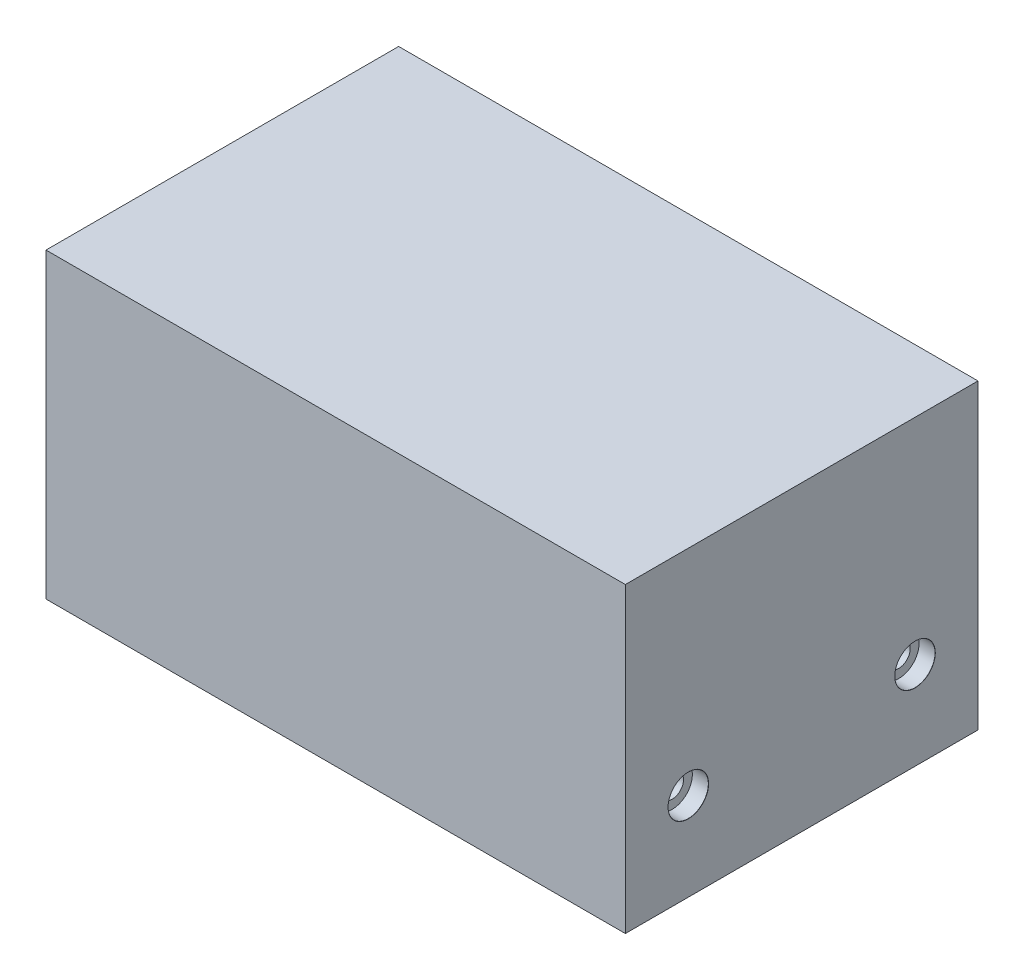
ISO-10303-21;
HEADER;
FILE_DESCRIPTION(('STEP AP214'),'2;1');
FILE_NAME('part.step','',(''),(''),'','','');
FILE_SCHEMA(('AUTOMOTIVE_DESIGN { 1 0 10303 214 1 1 1 1 }'));
ENDSEC;
DATA;
#1=APPLICATION_CONTEXT('core data for automotive mechanical design processes');
#2=APPLICATION_PROTOCOL_DEFINITION('international standard','automotive_design',2000,#1);
#3=PRODUCT_CONTEXT('',#1,'mechanical');
#4=PRODUCT('Part','Part','',(#3));
#5=PRODUCT_RELATED_PRODUCT_CATEGORY('part','',(#4));
#6=PRODUCT_DEFINITION_FORMATION('','',#4);
#7=PRODUCT_DEFINITION_CONTEXT('part definition',#1,'design');
#8=PRODUCT_DEFINITION('design','',#6,#7);
#9=PRODUCT_DEFINITION_SHAPE('','',#8);
#10=(LENGTH_UNIT() NAMED_UNIT(*) SI_UNIT(.MILLI.,.METRE.));
#11=(NAMED_UNIT(*) PLANE_ANGLE_UNIT() SI_UNIT($,.RADIAN.));
#12=(NAMED_UNIT(*) SI_UNIT($,.STERADIAN.) SOLID_ANGLE_UNIT());
#13=UNCERTAINTY_MEASURE_WITH_UNIT(LENGTH_MEASURE(1.E-05),#10,'distance_accuracy_value','');
#14=(GEOMETRIC_REPRESENTATION_CONTEXT(3) GLOBAL_UNCERTAINTY_ASSIGNED_CONTEXT((#13)) GLOBAL_UNIT_ASSIGNED_CONTEXT((#10,
#11,#12)) REPRESENTATION_CONTEXT('',''));
#15=CARTESIAN_POINT('',(0.,0.,0.));
#16=DIRECTION('',(0.,0.,1.));
#17=DIRECTION('',(1.,0.,0.));
#18=AXIS2_PLACEMENT_3D('',#15,#16,#17);
#19=CARTESIAN_POINT('',(110.,60.,-65.));
#20=DIRECTION('',(1.,0.,0.));
#21=DIRECTION('',(0.,0.,-1.));
#22=AXIS2_PLACEMENT_3D('',#19,#20,#21);
#23=PLANE('',#22);
#24=DIRECTION('',(0.,0.,-1.));
#25=VECTOR('',#24,1.);
#26=CARTESIAN_POINT('',(110.,25.,-5.00000000000002));
#27=LINE('',#26,#25);
#28=CARTESIAN_POINT('',(110.,25.,-5.00000000000002));
#29=VERTEX_POINT('',#28);
#30=CARTESIAN_POINT('',(110.,25.,-20.));
#31=VERTEX_POINT('',#30);
#32=EDGE_CURVE('E271',#29,#31,#27,.T.);
#33=ORIENTED_EDGE('',*,*,#32,.F.);
#34=DIRECTION('',(0.,-1.,0.));
#35=VECTOR('',#34,1.);
#36=CARTESIAN_POINT('',(110.,60.,-5.00000000000001));
#37=LINE('',#36,#35);
#38=CARTESIAN_POINT('',(110.,55.,-5.00000000000002));
#39=VERTEX_POINT('',#38);
#40=EDGE_CURVE('E177',#39,#29,#37,.T.);
#41=ORIENTED_EDGE('',*,*,#40,.F.);
#42=DIRECTION('',(0.,0.,1.));
#43=VECTOR('',#42,1.);
#44=CARTESIAN_POINT('',(110.,55.,-65.));
#45=LINE('',#44,#43);
#46=CARTESIAN_POINT('',(110.,55.,-65.));
#47=VERTEX_POINT('',#46);
#48=EDGE_CURVE('E212',#47,#39,#45,.T.);
#49=ORIENTED_EDGE('',*,*,#48,.F.);
#50=DIRECTION('',(0.,-1.,0.));
#51=VECTOR('',#50,1.);
#52=CARTESIAN_POINT('',(110.,60.,-65.));
#53=LINE('',#52,#51);
#54=CARTESIAN_POINT('',(110.,25.,-65.));
#55=VERTEX_POINT('',#54);
#56=EDGE_CURVE('E246',#47,#55,#53,.T.);
#57=ORIENTED_EDGE('',*,*,#56,.T.);
#58=DIRECTION('',(0.,0.,-1.));
#59=VECTOR('',#58,1.);
#60=CARTESIAN_POINT('',(110.,25.,-65.));
#61=LINE('',#60,#59);
#62=CARTESIAN_POINT('',(110.,25.,-50.));
#63=VERTEX_POINT('',#62);
#64=EDGE_CURVE('E191',#63,#55,#61,.T.);
#65=ORIENTED_EDGE('',*,*,#64,.F.);
#66=DIRECTION('',(0.,1.,0.));
#67=VECTOR('',#66,1.);
#68=CARTESIAN_POINT('',(110.,10.,-50.));
#69=LINE('',#68,#67);
#70=CARTESIAN_POINT('',(110.,10.,-50.));
#71=VERTEX_POINT('',#70);
#72=EDGE_CURVE('E181',#71,#63,#69,.T.);
#73=ORIENTED_EDGE('',*,*,#72,.F.);
#74=DIRECTION('',(0.,0.,1.));
#75=VECTOR('',#74,1.);
#76=CARTESIAN_POINT('',(110.,10.,-65.));
#77=LINE('',#76,#75);
#78=CARTESIAN_POINT('',(110.,10.,-65.));
#79=VERTEX_POINT('',#78);
#80=EDGE_CURVE('E178',#79,#71,#77,.T.);
#81=ORIENTED_EDGE('',*,*,#80,.F.);
#82=CARTESIAN_POINT('',(110.,5.,-65.));
#83=VERTEX_POINT('',#82);
#84=EDGE_CURVE('E245',#79,#83,#53,.T.);
#85=ORIENTED_EDGE('',*,*,#84,.T.);
#86=DIRECTION('',(0.,0.,1.));
#87=VECTOR('',#86,1.);
#88=CARTESIAN_POINT('',(110.,5.,-65.));
#89=LINE('',#88,#87);
#90=CARTESIAN_POINT('',(110.,5.,-5.00000000000001));
#91=VERTEX_POINT('',#90);
#92=EDGE_CURVE('E237',#83,#91,#89,.T.);
#93=ORIENTED_EDGE('',*,*,#92,.T.);
#94=CARTESIAN_POINT('',(110.,10.,-5.00000000000001));
#95=VERTEX_POINT('',#94);
#96=EDGE_CURVE('E243',#95,#91,#37,.T.);
#97=ORIENTED_EDGE('',*,*,#96,.F.);
#98=DIRECTION('',(0.,0.,1.));
#99=VECTOR('',#98,1.);
#100=CARTESIAN_POINT('',(110.,10.,-5.00000000000001));
#101=LINE('',#100,#99);
#102=CARTESIAN_POINT('',(110.,10.,-20.));
#103=VERTEX_POINT('',#102);
#104=EDGE_CURVE('E171',#103,#95,#101,.T.);
#105=ORIENTED_EDGE('',*,*,#104,.F.);
#106=DIRECTION('',(0.,-1.,0.));
#107=VECTOR('',#106,1.);
#108=CARTESIAN_POINT('',(110.,10.,-20.));
#109=LINE('',#108,#107);
#110=EDGE_CURVE('E275',#31,#103,#109,.T.);
#111=ORIENTED_EDGE('',*,*,#110,.F.);
#112=EDGE_LOOP('',(#33,#41,#49,#57,#65,#73,#81,#85,#93,#97,#105,#111));
#113=FACE_BOUND('',#112,.T.);
#114=ADVANCED_FACE('F38',(#113),#23,.F.);
#115=CARTESIAN_POINT('',(110.,60.,-5.00000000000001));
#116=DIRECTION('',(0.,0.,1.));
#117=DIRECTION('',(1.,0.,0.));
#118=AXIS2_PLACEMENT_3D('',#115,#116,#117);
#119=PLANE('',#118);
#120=DIRECTION('',(1.,0.,0.));
#121=VECTOR('',#120,1.);
#122=CARTESIAN_POINT('',(105.,25.,-5.00000000000001));
#123=LINE('',#122,#121);
#124=CARTESIAN_POINT('',(105.,25.,-5.00000000000001));
#125=VERTEX_POINT('',#124);
#126=EDGE_CURVE('E158',#125,#29,#123,.T.);
#127=ORIENTED_EDGE('',*,*,#126,.F.);
#128=DIRECTION('',(0.,1.,0.));
#129=VECTOR('',#128,1.);
#130=CARTESIAN_POINT('',(105.,10.,-5.00000000000001));
#131=LINE('',#130,#129);
#132=CARTESIAN_POINT('',(105.,10.,-5.00000000000001));
#133=VERTEX_POINT('',#132);
#134=EDGE_CURVE('E165',#133,#125,#131,.T.);
#135=ORIENTED_EDGE('',*,*,#134,.F.);
#136=DIRECTION('',(1.,0.,0.));
#137=VECTOR('',#136,1.);
#138=CARTESIAN_POINT('',(105.,10.,-5.00000000000001));
#139=LINE('',#138,#137);
#140=EDGE_CURVE('E55',#133,#95,#139,.T.);
#141=ORIENTED_EDGE('',*,*,#140,.T.);
#142=ORIENTED_EDGE('',*,*,#96,.T.);
#143=DIRECTION('',(-1.,0.,0.));
#144=VECTOR('',#143,1.);
#145=CARTESIAN_POINT('',(110.,5.,-5.00000000000001));
#146=LINE('',#145,#144);
#147=CARTESIAN_POINT('',(0.,5.,-5.00000000000001));
#148=VERTEX_POINT('',#147);
#149=EDGE_CURVE('E225',#91,#148,#146,.T.);
#150=ORIENTED_EDGE('',*,*,#149,.T.);
#151=DIRECTION('',(0.,-1.,0.));
#152=VECTOR('',#151,1.);
#153=CARTESIAN_POINT('',(0.,60.,-5.));
#154=LINE('',#153,#152);
#155=CARTESIAN_POINT('',(0.,55.,-4.99999999999999));
#156=VERTEX_POINT('',#155);
#157=EDGE_CURVE('E234',#156,#148,#154,.T.);
#158=ORIENTED_EDGE('',*,*,#157,.F.);
#159=DIRECTION('',(1.,0.,0.));
#160=VECTOR('',#159,1.);
#161=CARTESIAN_POINT('',(0.,55.,-4.99999999999999));
#162=LINE('',#161,#160);
#163=EDGE_CURVE('E215',#156,#39,#162,.T.);
#164=ORIENTED_EDGE('',*,*,#163,.T.);
#165=ORIENTED_EDGE('',*,*,#40,.T.);
#166=EDGE_LOOP('',(#127,#135,#141,#142,#150,#158,#164,#165));
#167=FACE_BOUND('',#166,.T.);
#168=ADVANCED_FACE('F174',(#167),#119,.F.);
#169=CARTESIAN_POINT('',(0.,60.,-65.));
#170=DIRECTION('',(0.,0.,-1.));
#171=DIRECTION('',(-1.,0.,0.));
#172=AXIS2_PLACEMENT_3D('',#169,#170,#171);
#173=PLANE('',#172);
#174=DIRECTION('',(1.,0.,0.));
#175=VECTOR('',#174,1.);
#176=CARTESIAN_POINT('',(105.,10.,-65.));
#177=LINE('',#176,#175);
#178=CARTESIAN_POINT('',(105.,10.,-65.));
#179=VERTEX_POINT('',#178);
#180=EDGE_CURVE('E63',#179,#79,#177,.T.);
#181=ORIENTED_EDGE('',*,*,#180,.F.);
#182=DIRECTION('',(0.,-1.,0.));
#183=VECTOR('',#182,1.);
#184=CARTESIAN_POINT('',(105.,10.,-65.));
#185=LINE('',#184,#183);
#186=CARTESIAN_POINT('',(105.,25.,-65.));
#187=VERTEX_POINT('',#186);
#188=EDGE_CURVE('E187',#187,#179,#185,.T.);
#189=ORIENTED_EDGE('',*,*,#188,.F.);
#190=DIRECTION('',(1.,0.,0.));
#191=VECTOR('',#190,1.);
#192=CARTESIAN_POINT('',(105.,25.,-65.));
#193=LINE('',#192,#191);
#194=EDGE_CURVE('E197',#187,#55,#193,.T.);
#195=ORIENTED_EDGE('',*,*,#194,.T.);
#196=ORIENTED_EDGE('',*,*,#56,.F.);
#197=DIRECTION('',(1.,0.,0.));
#198=VECTOR('',#197,1.);
#199=CARTESIAN_POINT('',(0.,55.,-65.));
#200=LINE('',#199,#198);
#201=CARTESIAN_POINT('',(0.,55.,-65.));
#202=VERTEX_POINT('',#201);
#203=EDGE_CURVE('E218',#202,#47,#200,.T.);
#204=ORIENTED_EDGE('',*,*,#203,.F.);
#205=DIRECTION('',(0.,-1.,0.));
#206=VECTOR('',#205,1.);
#207=CARTESIAN_POINT('',(0.,60.,-65.));
#208=LINE('',#207,#206);
#209=CARTESIAN_POINT('',(0.,5.,-65.));
#210=VERTEX_POINT('',#209);
#211=EDGE_CURVE('E248',#202,#210,#208,.T.);
#212=ORIENTED_EDGE('',*,*,#211,.T.);
#213=DIRECTION('',(1.,0.,0.));
#214=VECTOR('',#213,1.);
#215=CARTESIAN_POINT('',(0.,5.,-65.));
#216=LINE('',#215,#214);
#217=EDGE_CURVE('E220',#210,#83,#216,.T.);
#218=ORIENTED_EDGE('',*,*,#217,.T.);
#219=ORIENTED_EDGE('',*,*,#84,.F.);
#220=EDGE_LOOP('',(#181,#189,#195,#196,#204,#212,#218,#219));
#221=FACE_BOUND('',#220,.T.);
#222=ADVANCED_FACE('F328',(#221),#173,.F.);
#223=CARTESIAN_POINT('',(0.,5.,0.));
#224=DIRECTION('',(0.,-1.,0.));
#225=DIRECTION('',(0.,0.,-1.));
#226=AXIS2_PLACEMENT_3D('',#223,#224,#225);
#227=PLANE('',#226);
#228=ORIENTED_EDGE('',*,*,#149,.F.);
#229=ORIENTED_EDGE('',*,*,#92,.F.);
#230=ORIENTED_EDGE('',*,*,#217,.F.);
#231=DIRECTION('',(0.,0.,1.));
#232=VECTOR('',#231,1.);
#233=CARTESIAN_POINT('',(0.,5.,0.));
#234=LINE('',#233,#232);
#235=EDGE_CURVE('E251',#210,#148,#234,.T.);
#236=ORIENTED_EDGE('',*,*,#235,.T.);
#237=EDGE_LOOP('',(#228,#229,#230,#236));
#238=FACE_BOUND('',#237,.T.);
#239=ADVANCED_FACE('F303',(#238),#227,.F.);
#240=CARTESIAN_POINT('',(0.,5.,0.));
#241=DIRECTION('',(1.,0.,0.));
#242=DIRECTION('',(0.,0.,-1.));
#243=AXIS2_PLACEMENT_3D('',#240,#241,#242);
#244=PLANE('',#243);
#245=ORIENTED_EDGE('',*,*,#211,.F.);
#246=DIRECTION('',(0.,0.,1.));
#247=VECTOR('',#246,1.);
#248=CARTESIAN_POINT('',(0.,55.,-65.));
#249=LINE('',#248,#247);
#250=EDGE_CURVE('E213',#202,#156,#249,.T.);
#251=ORIENTED_EDGE('',*,*,#250,.T.);
#252=ORIENTED_EDGE('',*,*,#157,.T.);
#253=ORIENTED_EDGE('',*,*,#235,.F.);
#254=EDGE_LOOP('',(#245,#251,#252,#253));
#255=FACE_BOUND('',#254,.T.);
#256=DIRECTION('',(0.,0.,1.));
#257=VECTOR('',#256,1.);
#258=CARTESIAN_POINT('',(0.,0.,0.));
#259=LINE('',#258,#257);
#260=CARTESIAN_POINT('',(0.,0.,-70.));
#261=VERTEX_POINT('',#260);
#262=CARTESIAN_POINT('',(0.,0.,0.));
#263=VERTEX_POINT('',#262);
#264=EDGE_CURVE('E250',#261,#263,#259,.T.);
#265=ORIENTED_EDGE('',*,*,#264,.T.);
#266=DIRECTION('',(0.,-1.,0.));
#267=VECTOR('',#266,1.);
#268=CARTESIAN_POINT('',(0.,5.,0.));
#269=LINE('',#268,#267);
#270=CARTESIAN_POINT('',(0.,60.,0.));
#271=VERTEX_POINT('',#270);
#272=EDGE_CURVE('E11',#271,#263,#269,.T.);
#273=ORIENTED_EDGE('',*,*,#272,.F.);
#274=DIRECTION('',(0.,0.,1.));
#275=VECTOR('',#274,1.);
#276=CARTESIAN_POINT('',(0.,60.,-5.));
#277=LINE('',#276,#275);
#278=CARTESIAN_POINT('',(0.,60.,-70.));
#279=VERTEX_POINT('',#278);
#280=EDGE_CURVE('E221',#279,#271,#277,.T.);
#281=ORIENTED_EDGE('',*,*,#280,.F.);
#282=DIRECTION('',(0.,-1.,0.));
#283=VECTOR('',#282,1.);
#284=CARTESIAN_POINT('',(0.,5.,-70.));
#285=LINE('',#284,#283);
#286=EDGE_CURVE('E254',#279,#261,#285,.T.);
#287=ORIENTED_EDGE('',*,*,#286,.T.);
#288=EDGE_LOOP('',(#265,#273,#281,#287));
#289=FACE_BOUND('',#288,.T.);
#290=ADVANCED_FACE('F40',(#255,#289),#244,.F.);
#291=CARTESIAN_POINT('',(0.,5.,0.));
#292=DIRECTION('',(0.,0.,-1.));
#293=DIRECTION('',(-1.,0.,0.));
#294=AXIS2_PLACEMENT_3D('',#291,#292,#293);
#295=PLANE('',#294);
#296=DIRECTION('',(1.,0.,0.));
#297=VECTOR('',#296,1.);
#298=CARTESIAN_POINT('',(0.,0.,0.));
#299=LINE('',#298,#297);
#300=CARTESIAN_POINT('',(115.,0.,0.));
#301=VERTEX_POINT('',#300);
#302=EDGE_CURVE('E258',#263,#301,#299,.T.);
#303=ORIENTED_EDGE('',*,*,#302,.T.);
#304=DIRECTION('',(0.,-1.,0.));
#305=VECTOR('',#304,1.);
#306=CARTESIAN_POINT('',(115.,5.,0.));
#307=LINE('',#306,#305);
#308=CARTESIAN_POINT('',(115.,60.,0.));
#309=VERTEX_POINT('',#308);
#310=EDGE_CURVE('E47',#309,#301,#307,.T.);
#311=ORIENTED_EDGE('',*,*,#310,.F.);
#312=DIRECTION('',(1.,0.,0.));
#313=VECTOR('',#312,1.);
#314=CARTESIAN_POINT('',(0.,60.,0.));
#315=LINE('',#314,#313);
#316=EDGE_CURVE('E224',#271,#309,#315,.T.);
#317=ORIENTED_EDGE('',*,*,#316,.F.);
#318=ORIENTED_EDGE('',*,*,#272,.T.);
#319=EDGE_LOOP('',(#303,#311,#317,#318));
#320=FACE_BOUND('',#319,.T.);
#321=ADVANCED_FACE('F347',(#320),#295,.F.);
#322=CARTESIAN_POINT('',(115.,5.,0.));
#323=DIRECTION('',(-1.,0.,0.));
#324=DIRECTION('',(0.,0.,1.));
#325=AXIS2_PLACEMENT_3D('',#322,#323,#324);
#326=PLANE('',#325);
#327=CARTESIAN_POINT('',(115.,17.5,-12.5));
#328=DIRECTION('',(1.,0.,0.));
#329=DIRECTION('',(0.,0.,-1.));
#330=AXIS2_PLACEMENT_3D('',#327,#328,#329);
#331=CIRCLE('',#330,4.025);
#332=CARTESIAN_POINT('',(115.,17.5,-16.525));
#333=VERTEX_POINT('',#332);
#334=EDGE_CURVE('E605',#333,#333,#331,.T.);
#335=ORIENTED_EDGE('',*,*,#334,.F.);
#336=EDGE_LOOP('',(#335));
#337=FACE_BOUND('',#336,.T.);
#338=CARTESIAN_POINT('',(115.,17.5,-57.5));
#339=DIRECTION('',(1.,0.,0.));
#340=DIRECTION('',(0.,0.,-1.));
#341=AXIS2_PLACEMENT_3D('',#338,#339,#340);
#342=CIRCLE('',#341,4.025);
#343=CARTESIAN_POINT('',(115.,17.5,-61.525));
#344=VERTEX_POINT('',#343);
#345=EDGE_CURVE('E615',#344,#344,#342,.T.);
#346=ORIENTED_EDGE('',*,*,#345,.F.);
#347=EDGE_LOOP('',(#346));
#348=FACE_BOUND('',#347,.T.);
#349=DIRECTION('',(0.,0.,-1.));
#350=VECTOR('',#349,1.);
#351=CARTESIAN_POINT('',(115.,0.,0.));
#352=LINE('',#351,#350);
#353=CARTESIAN_POINT('',(115.,0.,-70.));
#354=VERTEX_POINT('',#353);
#355=EDGE_CURVE('E260',#301,#354,#352,.T.);
#356=ORIENTED_EDGE('',*,*,#355,.T.);
#357=DIRECTION('',(0.,-1.,0.));
#358=VECTOR('',#357,1.);
#359=CARTESIAN_POINT('',(115.,5.,-70.));
#360=LINE('',#359,#358);
#361=CARTESIAN_POINT('',(115.,60.,-70.));
#362=VERTEX_POINT('',#361);
#363=EDGE_CURVE('E265',#362,#354,#360,.T.);
#364=ORIENTED_EDGE('',*,*,#363,.F.);
#365=DIRECTION('',(0.,0.,-1.));
#366=VECTOR('',#365,1.);
#367=CARTESIAN_POINT('',(115.,60.,0.));
#368=LINE('',#367,#366);
#369=EDGE_CURVE('E228',#309,#362,#368,.T.);
#370=ORIENTED_EDGE('',*,*,#369,.F.);
#371=ORIENTED_EDGE('',*,*,#310,.T.);
#372=EDGE_LOOP('',(#356,#364,#370,#371));
#373=FACE_BOUND('',#372,.T.);
#374=ADVANCED_FACE('F344',(#337,#348,#373),#326,.F.);
#375=CARTESIAN_POINT('',(0.,5.,-70.));
#376=DIRECTION('',(0.,0.,1.));
#377=DIRECTION('',(1.,0.,0.));
#378=AXIS2_PLACEMENT_3D('',#375,#376,#377);
#379=PLANE('',#378);
#380=DIRECTION('',(-1.,0.,0.));
#381=VECTOR('',#380,1.);
#382=CARTESIAN_POINT('',(0.,0.,-70.));
#383=LINE('',#382,#381);
#384=EDGE_CURVE('E255',#354,#261,#383,.T.);
#385=ORIENTED_EDGE('',*,*,#384,.T.);
#386=ORIENTED_EDGE('',*,*,#286,.F.);
#387=DIRECTION('',(-1.,0.,0.));
#388=VECTOR('',#387,1.);
#389=CARTESIAN_POINT('',(115.,60.,-70.));
#390=LINE('',#389,#388);
#391=EDGE_CURVE('E231',#362,#279,#390,.T.);
#392=ORIENTED_EDGE('',*,*,#391,.F.);
#393=ORIENTED_EDGE('',*,*,#363,.T.);
#394=EDGE_LOOP('',(#385,#386,#392,#393));
#395=FACE_BOUND('',#394,.T.);
#396=ADVANCED_FACE('F340',(#395),#379,.F.);
#397=CARTESIAN_POINT('',(0.,0.,0.));
#398=DIRECTION('',(0.,-1.,0.));
#399=DIRECTION('',(0.,0.,-1.));
#400=AXIS2_PLACEMENT_3D('',#397,#398,#399);
#401=PLANE('',#400);
#402=ORIENTED_EDGE('',*,*,#264,.F.);
#403=ORIENTED_EDGE('',*,*,#384,.F.);
#404=ORIENTED_EDGE('',*,*,#355,.F.);
#405=ORIENTED_EDGE('',*,*,#302,.F.);
#406=EDGE_LOOP('',(#402,#403,#404,#405));
#407=FACE_BOUND('',#406,.T.);
#408=ADVANCED_FACE('F336',(#407),#401,.T.);
#409=CARTESIAN_POINT('',(0.,60.,0.));
#410=DIRECTION('',(0.,1.,0.));
#411=DIRECTION('',(0.,0.,1.));
#412=AXIS2_PLACEMENT_3D('',#409,#410,#411);
#413=PLANE('',#412);
#414=ORIENTED_EDGE('',*,*,#391,.T.);
#415=ORIENTED_EDGE('',*,*,#280,.T.);
#416=ORIENTED_EDGE('',*,*,#316,.T.);
#417=ORIENTED_EDGE('',*,*,#369,.T.);
#418=EDGE_LOOP('',(#414,#415,#416,#417));
#419=FACE_BOUND('',#418,.T.);
#420=ADVANCED_FACE('F339',(#419),#413,.T.);
#421=CARTESIAN_POINT('',(0.,55.,-65.));
#422=DIRECTION('',(0.,1.,0.));
#423=DIRECTION('',(0.,0.,1.));
#424=AXIS2_PLACEMENT_3D('',#421,#422,#423);
#425=PLANE('',#424);
#426=ORIENTED_EDGE('',*,*,#48,.T.);
#427=ORIENTED_EDGE('',*,*,#163,.F.);
#428=ORIENTED_EDGE('',*,*,#250,.F.);
#429=ORIENTED_EDGE('',*,*,#203,.T.);
#430=EDGE_LOOP('',(#426,#427,#428,#429));
#431=FACE_BOUND('',#430,.T.);
#432=ADVANCED_FACE('F364',(#431),#425,.F.);
#433=CARTESIAN_POINT('',(105.,10.,-65.));
#434=DIRECTION('',(0.,1.,0.));
#435=DIRECTION('',(0.,0.,1.));
#436=AXIS2_PLACEMENT_3D('',#433,#434,#435);
#437=PLANE('',#436);
#438=ORIENTED_EDGE('',*,*,#80,.T.);
#439=DIRECTION('',(1.,0.,0.));
#440=VECTOR('',#439,1.);
#441=CARTESIAN_POINT('',(105.,10.,-50.));
#442=LINE('',#441,#440);
#443=CARTESIAN_POINT('',(105.,10.,-50.));
#444=VERTEX_POINT('',#443);
#445=EDGE_CURVE('E208',#444,#71,#442,.T.);
#446=ORIENTED_EDGE('',*,*,#445,.F.);
#447=DIRECTION('',(0.,0.,1.));
#448=VECTOR('',#447,1.);
#449=CARTESIAN_POINT('',(105.,10.,-65.));
#450=LINE('',#449,#448);
#451=EDGE_CURVE('E190',#179,#444,#450,.T.);
#452=ORIENTED_EDGE('',*,*,#451,.F.);
#453=ORIENTED_EDGE('',*,*,#180,.T.);
#454=EDGE_LOOP('',(#438,#446,#452,#453));
#455=FACE_BOUND('',#454,.T.);
#456=ADVANCED_FACE('F368',(#455),#437,.F.);
#457=CARTESIAN_POINT('',(105.,10.,-50.));
#458=DIRECTION('',(0.,0.,-1.));
#459=DIRECTION('',(-1.,0.,0.));
#460=AXIS2_PLACEMENT_3D('',#457,#458,#459);
#461=PLANE('',#460);
#462=ORIENTED_EDGE('',*,*,#72,.T.);
#463=DIRECTION('',(1.,0.,0.));
#464=VECTOR('',#463,1.);
#465=CARTESIAN_POINT('',(105.,25.,-50.));
#466=LINE('',#465,#464);
#467=CARTESIAN_POINT('',(105.,25.,-50.));
#468=VERTEX_POINT('',#467);
#469=EDGE_CURVE('E205',#468,#63,#466,.T.);
#470=ORIENTED_EDGE('',*,*,#469,.F.);
#471=DIRECTION('',(0.,1.,0.));
#472=VECTOR('',#471,1.);
#473=CARTESIAN_POINT('',(105.,10.,-50.));
#474=LINE('',#473,#472);
#475=EDGE_CURVE('E193',#444,#468,#474,.T.);
#476=ORIENTED_EDGE('',*,*,#475,.F.);
#477=ORIENTED_EDGE('',*,*,#445,.T.);
#478=EDGE_LOOP('',(#462,#470,#476,#477));
#479=FACE_BOUND('',#478,.T.);
#480=ADVANCED_FACE('F373',(#479),#461,.F.);
#481=CARTESIAN_POINT('',(105.,25.,-65.));
#482=DIRECTION('',(0.,-1.,0.));
#483=DIRECTION('',(0.,0.,-1.));
#484=AXIS2_PLACEMENT_3D('',#481,#482,#483);
#485=PLANE('',#484);
#486=ORIENTED_EDGE('',*,*,#64,.T.);
#487=ORIENTED_EDGE('',*,*,#194,.F.);
#488=DIRECTION('',(0.,0.,-1.));
#489=VECTOR('',#488,1.);
#490=CARTESIAN_POINT('',(105.,25.,-65.));
#491=LINE('',#490,#489);
#492=EDGE_CURVE('E195',#468,#187,#491,.T.);
#493=ORIENTED_EDGE('',*,*,#492,.F.);
#494=ORIENTED_EDGE('',*,*,#469,.T.);
#495=EDGE_LOOP('',(#486,#487,#493,#494));
#496=FACE_BOUND('',#495,.T.);
#497=ADVANCED_FACE('F377',(#496),#485,.F.);
#498=CARTESIAN_POINT('',(105.,0.,0.));
#499=DIRECTION('',(1.,0.,0.));
#500=DIRECTION('',(0.,0.,-1.));
#501=AXIS2_PLACEMENT_3D('',#498,#499,#500);
#502=PLANE('',#501);
#503=CARTESIAN_POINT('',(105.,17.5,-57.5));
#504=DIRECTION('',(1.,0.,0.));
#505=DIRECTION('',(0.,0.,-1.));
#506=AXIS2_PLACEMENT_3D('',#503,#504,#505);
#507=CIRCLE('',#506,2.25);
#508=CARTESIAN_POINT('',(105.,17.5,-59.75));
#509=VERTEX_POINT('',#508);
#510=EDGE_CURVE('E269',#509,#509,#507,.T.);
#511=ORIENTED_EDGE('',*,*,#510,.T.);
#512=EDGE_LOOP('',(#511));
#513=FACE_BOUND('',#512,.T.);
#514=ORIENTED_EDGE('',*,*,#188,.T.);
#515=ORIENTED_EDGE('',*,*,#451,.T.);
#516=ORIENTED_EDGE('',*,*,#475,.T.);
#517=ORIENTED_EDGE('',*,*,#492,.T.);
#518=EDGE_LOOP('',(#514,#515,#516,#517));
#519=FACE_BOUND('',#518,.T.);
#520=ADVANCED_FACE('F321',(#513,#519),#502,.F.);
#521=CARTESIAN_POINT('',(105.,25.,-5.00000000000001));
#522=DIRECTION('',(0.,-1.,0.));
#523=DIRECTION('',(0.,0.,-1.));
#524=AXIS2_PLACEMENT_3D('',#521,#522,#523);
#525=PLANE('',#524);
#526=ORIENTED_EDGE('',*,*,#32,.T.);
#527=DIRECTION('',(1.,0.,0.));
#528=VECTOR('',#527,1.);
#529=CARTESIAN_POINT('',(105.,25.,-20.));
#530=LINE('',#529,#528);
#531=CARTESIAN_POINT('',(105.,25.,-20.));
#532=VERTEX_POINT('',#531);
#533=EDGE_CURVE('E161',#532,#31,#530,.T.);
#534=ORIENTED_EDGE('',*,*,#533,.F.);
#535=DIRECTION('',(0.,0.,-1.));
#536=VECTOR('',#535,1.);
#537=CARTESIAN_POINT('',(105.,25.,-5.00000000000001));
#538=LINE('',#537,#536);
#539=EDGE_CURVE('E154',#125,#532,#538,.T.);
#540=ORIENTED_EDGE('',*,*,#539,.F.);
#541=ORIENTED_EDGE('',*,*,#126,.T.);
#542=EDGE_LOOP('',(#526,#534,#540,#541));
#543=FACE_BOUND('',#542,.T.);
#544=ADVANCED_FACE('F156',(#543),#525,.F.);
#545=CARTESIAN_POINT('',(105.,10.,-20.));
#546=DIRECTION('',(0.,0.,1.));
#547=DIRECTION('',(1.,0.,0.));
#548=AXIS2_PLACEMENT_3D('',#545,#546,#547);
#549=PLANE('',#548);
#550=ORIENTED_EDGE('',*,*,#110,.T.);
#551=DIRECTION('',(1.,0.,0.));
#552=VECTOR('',#551,1.);
#553=CARTESIAN_POINT('',(105.,10.,-20.));
#554=LINE('',#553,#552);
#555=CARTESIAN_POINT('',(105.,10.,-20.));
#556=VERTEX_POINT('',#555);
#557=EDGE_CURVE('E183',#556,#103,#554,.T.);
#558=ORIENTED_EDGE('',*,*,#557,.F.);
#559=DIRECTION('',(0.,-1.,0.));
#560=VECTOR('',#559,1.);
#561=CARTESIAN_POINT('',(105.,10.,-20.));
#562=LINE('',#561,#560);
#563=EDGE_CURVE('E164',#532,#556,#562,.T.);
#564=ORIENTED_EDGE('',*,*,#563,.F.);
#565=ORIENTED_EDGE('',*,*,#533,.T.);
#566=EDGE_LOOP('',(#550,#558,#564,#565));
#567=FACE_BOUND('',#566,.T.);
#568=ADVANCED_FACE('F313',(#567),#549,.F.);
#569=CARTESIAN_POINT('',(105.,10.,-5.00000000000001));
#570=DIRECTION('',(0.,1.,0.));
#571=DIRECTION('',(0.,0.,1.));
#572=AXIS2_PLACEMENT_3D('',#569,#570,#571);
#573=PLANE('',#572);
#574=ORIENTED_EDGE('',*,*,#104,.T.);
#575=ORIENTED_EDGE('',*,*,#140,.F.);
#576=DIRECTION('',(0.,0.,1.));
#577=VECTOR('',#576,1.);
#578=CARTESIAN_POINT('',(105.,10.,-5.00000000000001));
#579=LINE('',#578,#577);
#580=EDGE_CURVE('E169',#556,#133,#579,.T.);
#581=ORIENTED_EDGE('',*,*,#580,.F.);
#582=ORIENTED_EDGE('',*,*,#557,.T.);
#583=EDGE_LOOP('',(#574,#575,#581,#582));
#584=FACE_BOUND('',#583,.T.);
#585=ADVANCED_FACE('F294',(#584),#573,.F.);
#586=CARTESIAN_POINT('',(105.,0.,0.));
#587=DIRECTION('',(-1.,0.,0.));
#588=DIRECTION('',(0.,0.,1.));
#589=AXIS2_PLACEMENT_3D('',#586,#587,#588);
#590=PLANE('',#589);
#591=CARTESIAN_POINT('',(105.,17.5,-12.5));
#592=DIRECTION('',(-1.,0.,0.));
#593=DIRECTION('',(0.,0.,1.));
#594=AXIS2_PLACEMENT_3D('',#591,#592,#593);
#595=CIRCLE('',#594,2.25);
#596=CARTESIAN_POINT('',(105.,17.5,-10.25));
#597=VERTEX_POINT('',#596);
#598=EDGE_CURVE('E42',#597,#597,#595,.T.);
#599=ORIENTED_EDGE('',*,*,#598,.F.);
#600=EDGE_LOOP('',(#599));
#601=FACE_BOUND('',#600,.T.);
#602=ORIENTED_EDGE('',*,*,#134,.T.);
#603=ORIENTED_EDGE('',*,*,#539,.T.);
#604=ORIENTED_EDGE('',*,*,#563,.T.);
#605=ORIENTED_EDGE('',*,*,#580,.T.);
#606=EDGE_LOOP('',(#602,#603,#604,#605));
#607=FACE_BOUND('',#606,.T.);
#608=ADVANCED_FACE('F168',(#601,#607),#590,.T.);
#609=CARTESIAN_POINT('',(115.,17.5,-57.5));
#610=DIRECTION('',(1.,0.,0.));
#611=DIRECTION('',(0.,0.,-1.));
#612=AXIS2_PLACEMENT_3D('',#609,#610,#611);
#613=CYLINDRICAL_SURFACE('',#612,2.25);
#614=CARTESIAN_POINT('',(111.8,17.5,-57.5));
#615=DIRECTION('',(1.,0.,0.));
#616=DIRECTION('',(0.,0.,-1.));
#617=AXIS2_PLACEMENT_3D('',#614,#615,#616);
#618=CIRCLE('',#617,2.25);
#619=CARTESIAN_POINT('',(111.8,17.5,-59.75));
#620=VERTEX_POINT('',#619);
#621=EDGE_CURVE('E272',#620,#620,#618,.T.);
#622=ORIENTED_EDGE('',*,*,#621,.T.);
#623=EDGE_LOOP('',(#622));
#624=FACE_BOUND('',#623,.T.);
#625=ORIENTED_EDGE('',*,*,#510,.F.);
#626=EDGE_LOOP('',(#625));
#627=FACE_BOUND('',#626,.T.);
#628=ADVANCED_FACE('F516',(#624,#627),#613,.F.);
#629=CARTESIAN_POINT('',(111.8,19.75,-57.5));
#630=DIRECTION('',(-1.,0.,0.));
#631=DIRECTION('',(0.,0.,1.));
#632=AXIS2_PLACEMENT_3D('',#629,#630,#631);
#633=PLANE('',#632);
#634=ORIENTED_EDGE('',*,*,#621,.F.);
#635=EDGE_LOOP('',(#634));
#636=FACE_BOUND('',#635,.T.);
#637=CARTESIAN_POINT('',(111.8,17.5,-57.5));
#638=DIRECTION('',(1.,0.,0.));
#639=DIRECTION('',(0.,0.,-1.));
#640=AXIS2_PLACEMENT_3D('',#637,#638,#639);
#641=CIRCLE('',#640,4.);
#642=CARTESIAN_POINT('',(111.8,17.5,-61.5));
#643=VERTEX_POINT('',#642);
#644=EDGE_CURVE('E278',#643,#643,#641,.T.);
#645=ORIENTED_EDGE('',*,*,#644,.T.);
#646=EDGE_LOOP('',(#645));
#647=FACE_BOUND('',#646,.T.);
#648=ADVANCED_FACE('F523',(#636,#647),#633,.F.);
#649=CARTESIAN_POINT('',(115.,17.5,-57.5));
#650=DIRECTION('',(1.,0.,0.));
#651=DIRECTION('',(0.,0.,-1.));
#652=AXIS2_PLACEMENT_3D('',#649,#650,#651);
#653=CYLINDRICAL_SURFACE('',#652,4.);
#654=ORIENTED_EDGE('',*,*,#644,.F.);
#655=EDGE_LOOP('',(#654));
#656=FACE_BOUND('',#655,.T.);
#657=CARTESIAN_POINT('',(114.975,17.5,-57.5));
#658=DIRECTION('',(1.,0.,0.));
#659=DIRECTION('',(0.,0.,-1.));
#660=AXIS2_PLACEMENT_3D('',#657,#658,#659);
#661=CIRCLE('',#660,4.);
#662=CARTESIAN_POINT('',(114.975,17.5,-61.5));
#663=VERTEX_POINT('',#662);
#664=EDGE_CURVE('E283',#663,#663,#661,.T.);
#665=ORIENTED_EDGE('',*,*,#664,.T.);
#666=EDGE_LOOP('',(#665));
#667=FACE_BOUND('',#666,.T.);
#668=ADVANCED_FACE('F530',(#656,#667),#653,.F.);
#669=CARTESIAN_POINT('',(115.,17.5,-57.5));
#670=DIRECTION('',(1.,0.,0.));
#671=DIRECTION('',(0.,0.,-1.));
#672=AXIS2_PLACEMENT_3D('',#669,#670,#671);
#673=CONICAL_SURFACE('',#672,4.025,0.785398163397448);
#674=ORIENTED_EDGE('',*,*,#664,.F.);
#675=EDGE_LOOP('',(#674));
#676=FACE_BOUND('',#675,.T.);
#677=ORIENTED_EDGE('',*,*,#345,.T.);
#678=EDGE_LOOP('',(#677));
#679=FACE_BOUND('',#678,.T.);
#680=ADVANCED_FACE('F538',(#676,#679),#673,.F.);
#681=CARTESIAN_POINT('',(115.,17.5,-12.5));
#682=DIRECTION('',(1.,0.,0.));
#683=DIRECTION('',(0.,0.,-1.));
#684=AXIS2_PLACEMENT_3D('',#681,#682,#683);
#685=CYLINDRICAL_SURFACE('',#684,2.25);
#686=ORIENTED_EDGE('',*,*,#598,.T.);
#687=EDGE_LOOP('',(#686));
#688=FACE_BOUND('',#687,.T.);
#689=CARTESIAN_POINT('',(111.8,17.5,-12.5));
#690=DIRECTION('',(1.,0.,0.));
#691=DIRECTION('',(0.,0.,-1.));
#692=AXIS2_PLACEMENT_3D('',#689,#690,#691);
#693=CIRCLE('',#692,2.25);
#694=CARTESIAN_POINT('',(111.8,17.5,-14.75));
#695=VERTEX_POINT('',#694);
#696=EDGE_CURVE('E612',#695,#695,#693,.T.);
#697=ORIENTED_EDGE('',*,*,#696,.T.);
#698=EDGE_LOOP('',(#697));
#699=FACE_BOUND('',#698,.T.);
#700=ADVANCED_FACE('F546',(#688,#699),#685,.F.);
#701=CARTESIAN_POINT('',(111.8,19.75,-12.5));
#702=DIRECTION('',(-1.,0.,0.));
#703=DIRECTION('',(0.,0.,1.));
#704=AXIS2_PLACEMENT_3D('',#701,#702,#703);
#705=PLANE('',#704);
#706=ORIENTED_EDGE('',*,*,#696,.F.);
#707=EDGE_LOOP('',(#706));
#708=FACE_BOUND('',#707,.T.);
#709=CARTESIAN_POINT('',(111.8,17.5,-12.5));
#710=DIRECTION('',(1.,0.,0.));
#711=DIRECTION('',(0.,0.,-1.));
#712=AXIS2_PLACEMENT_3D('',#709,#710,#711);
#713=CIRCLE('',#712,4.);
#714=CARTESIAN_POINT('',(111.8,17.5,-16.5));
#715=VERTEX_POINT('',#714);
#716=EDGE_CURVE('E607',#715,#715,#713,.T.);
#717=ORIENTED_EDGE('',*,*,#716,.T.);
#718=EDGE_LOOP('',(#717));
#719=FACE_BOUND('',#718,.T.);
#720=ADVANCED_FACE('F554',(#708,#719),#705,.F.);
#721=CARTESIAN_POINT('',(115.,17.5,-12.5));
#722=DIRECTION('',(1.,0.,0.));
#723=DIRECTION('',(0.,0.,-1.));
#724=AXIS2_PLACEMENT_3D('',#721,#722,#723);
#725=CYLINDRICAL_SURFACE('',#724,4.);
#726=ORIENTED_EDGE('',*,*,#716,.F.);
#727=EDGE_LOOP('',(#726));
#728=FACE_BOUND('',#727,.T.);
#729=CARTESIAN_POINT('',(114.975,17.5,-12.5));
#730=DIRECTION('',(1.,0.,0.));
#731=DIRECTION('',(0.,0.,-1.));
#732=AXIS2_PLACEMENT_3D('',#729,#730,#731);
#733=CIRCLE('',#732,4.);
#734=CARTESIAN_POINT('',(114.975,17.5,-16.5));
#735=VERTEX_POINT('',#734);
#736=EDGE_CURVE('E602',#735,#735,#733,.T.);
#737=ORIENTED_EDGE('',*,*,#736,.T.);
#738=EDGE_LOOP('',(#737));
#739=FACE_BOUND('',#738,.T.);
#740=ADVANCED_FACE('F562',(#728,#739),#725,.F.);
#741=CARTESIAN_POINT('',(115.,17.5,-12.5));
#742=DIRECTION('',(1.,0.,0.));
#743=DIRECTION('',(0.,0.,-1.));
#744=AXIS2_PLACEMENT_3D('',#741,#742,#743);
#745=CONICAL_SURFACE('',#744,4.025,0.785398163397448);
#746=ORIENTED_EDGE('',*,*,#736,.F.);
#747=EDGE_LOOP('',(#746));
#748=FACE_BOUND('',#747,.T.);
#749=ORIENTED_EDGE('',*,*,#334,.T.);
#750=EDGE_LOOP('',(#749));
#751=FACE_BOUND('',#750,.T.);
#752=ADVANCED_FACE('F570',(#748,#751),#745,.F.);
#753=CLOSED_SHELL('',(#114,#168,#222,#239,#290,#321,#374,#396,#408,#420,#432,#456,#480,#497,
#520,#544,#568,#585,#608,#628,#648,#668,#680,#700,#720,#740,#752));
#754=MANIFOLD_SOLID_BREP('B2',#753);
#755=ADVANCED_BREP_SHAPE_REPRESENTATION('',(#18,#754),#14);
#756=SHAPE_DEFINITION_REPRESENTATION(#9,#755);
ENDSEC;
END-ISO-10303-21;
